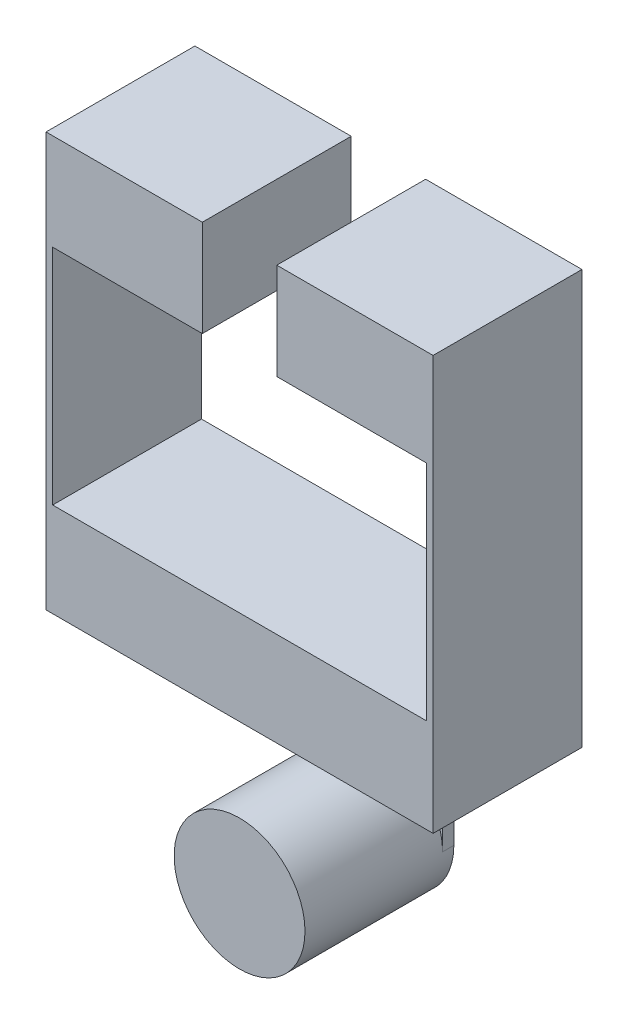
ISO-10303-21;
HEADER;
FILE_DESCRIPTION(('STEP AP214'),'2;1');
FILE_NAME('part.step','',(''),(''),'','','');
FILE_SCHEMA(('AUTOMOTIVE_DESIGN { 1 0 10303 214 1 1 1 1 }'));
ENDSEC;
DATA;
#1=APPLICATION_CONTEXT('core data for automotive mechanical design processes');
#2=APPLICATION_PROTOCOL_DEFINITION('international standard','automotive_design',2000,#1);
#3=PRODUCT_CONTEXT('',#1,'mechanical');
#4=PRODUCT('Part','Part','',(#3));
#5=PRODUCT_RELATED_PRODUCT_CATEGORY('part','',(#4));
#6=PRODUCT_DEFINITION_FORMATION('','',#4);
#7=PRODUCT_DEFINITION_CONTEXT('part definition',#1,'design');
#8=PRODUCT_DEFINITION('design','',#6,#7);
#9=PRODUCT_DEFINITION_SHAPE('','',#8);
#10=(LENGTH_UNIT() NAMED_UNIT(*) SI_UNIT(.MILLI.,.METRE.));
#11=(NAMED_UNIT(*) PLANE_ANGLE_UNIT() SI_UNIT($,.RADIAN.));
#12=(NAMED_UNIT(*) SI_UNIT($,.STERADIAN.) SOLID_ANGLE_UNIT());
#13=UNCERTAINTY_MEASURE_WITH_UNIT(LENGTH_MEASURE(1.E-05),#10,'distance_accuracy_value','');
#14=(GEOMETRIC_REPRESENTATION_CONTEXT(3) GLOBAL_UNCERTAINTY_ASSIGNED_CONTEXT((#13)) GLOBAL_UNIT_ASSIGNED_CONTEXT((#10,
#11,#12)) REPRESENTATION_CONTEXT('',''));
#15=CARTESIAN_POINT('',(0.,0.,0.));
#16=DIRECTION('',(0.,0.,1.));
#17=DIRECTION('',(1.,0.,0.));
#18=AXIS2_PLACEMENT_3D('',#15,#16,#17);
#19=CARTESIAN_POINT('',(0.,41.4643705136554,0.));
#20=DIRECTION('',(0.,-1.,0.));
#21=DIRECTION('',(0.,0.,-1.));
#22=AXIS2_PLACEMENT_3D('',#19,#20,#21);
#23=PLANE('',#22);
#24=DIRECTION('',(0.,0.,1.));
#25=VECTOR('',#24,1.);
#26=CARTESIAN_POINT('',(31.8903580164554,41.4643705136554,-25.4));
#27=LINE('',#26,#25);
#28=CARTESIAN_POINT('',(31.8903580164554,41.4643705136554,-25.4));
#29=VERTEX_POINT('',#28);
#30=CARTESIAN_POINT('',(31.8903580164554,41.4643705136554,0.));
#31=VERTEX_POINT('',#30);
#32=EDGE_CURVE('E69',#29,#31,#27,.T.);
#33=ORIENTED_EDGE('',*,*,#32,.F.);
#34=DIRECTION('',(-1.,0.,0.));
#35=VECTOR('',#34,1.);
#36=CARTESIAN_POINT('',(-33.02,41.4643705136554,-25.4));
#37=LINE('',#36,#35);
#38=CARTESIAN_POINT('',(-31.8903580164554,41.4643705136554,-25.4));
#39=VERTEX_POINT('',#38);
#40=EDGE_CURVE('E263',#29,#39,#37,.T.);
#41=ORIENTED_EDGE('',*,*,#40,.T.);
#42=DIRECTION('',(0.,0.,-1.));
#43=VECTOR('',#42,1.);
#44=CARTESIAN_POINT('',(-31.8903580164554,41.4643705136554,-25.4));
#45=LINE('',#44,#43);
#46=CARTESIAN_POINT('',(-31.8903580164554,41.4643705136554,0.));
#47=VERTEX_POINT('',#46);
#48=EDGE_CURVE('E243',#47,#39,#45,.T.);
#49=ORIENTED_EDGE('',*,*,#48,.F.);
#50=DIRECTION('',(1.,0.,0.));
#51=VECTOR('',#50,1.);
#52=CARTESIAN_POINT('',(-33.02,41.4643705136554,0.));
#53=LINE('',#52,#51);
#54=EDGE_CURVE('E74',#47,#31,#53,.T.);
#55=ORIENTED_EDGE('',*,*,#54,.T.);
#56=EDGE_LOOP('',(#33,#41,#49,#55));
#57=FACE_BOUND('',#56,.T.);
#58=ADVANCED_FACE('F52',(#57),#23,.F.);
#59=CARTESIAN_POINT('',(0.,0.,-25.4));
#60=DIRECTION('',(0.,0.,1.));
#61=DIRECTION('',(1.,0.,0.));
#62=AXIS2_PLACEMENT_3D('',#59,#60,#61);
#63=CYLINDRICAL_SURFACE('',#62,11.1628049548617);
#64=DIRECTION('',(0.,0.,-1.));
#65=VECTOR('',#64,1.);
#66=CARTESIAN_POINT('',(11.1628049548617,0.,-23.4735684489951));
#67=LINE('',#66,#65);
#68=CARTESIAN_POINT('',(11.1628049548617,0.,-23.4735684489951));
#69=VERTEX_POINT('',#68);
#70=CARTESIAN_POINT('',(11.1628049548617,0.,-25.4));
#71=VERTEX_POINT('',#70);
#72=EDGE_CURVE('E320',#69,#71,#67,.T.);
#73=ORIENTED_EDGE('',*,*,#72,.F.);
#74=CARTESIAN_POINT('',(0.,0.,-23.4735684489951));
#75=DIRECTION('',(0.,0.,1.));
#76=DIRECTION('',(-1.,0.,0.));
#77=AXIS2_PLACEMENT_3D('',#74,#75,#76);
#78=CIRCLE('',#77,11.1628049548617);
#79=CARTESIAN_POINT('',(-11.1628049548617,0.,-23.4735684489951));
#80=VERTEX_POINT('',#79);
#81=EDGE_CURVE('E296',#69,#80,#78,.T.);
#82=ORIENTED_EDGE('',*,*,#81,.T.);
#83=DIRECTION('',(0.,0.,-1.));
#84=VECTOR('',#83,1.);
#85=CARTESIAN_POINT('',(-11.1628049548617,0.,-23.4735684489951));
#86=LINE('',#85,#84);
#87=CARTESIAN_POINT('',(-11.1628049548617,0.,-25.4));
#88=VERTEX_POINT('',#87);
#89=EDGE_CURVE('E313',#80,#88,#86,.T.);
#90=ORIENTED_EDGE('',*,*,#89,.T.);
#91=CARTESIAN_POINT('',(0.,0.,-25.4));
#92=DIRECTION('',(0.,0.,1.));
#93=DIRECTION('',(1.,0.,0.));
#94=AXIS2_PLACEMENT_3D('',#91,#92,#93);
#95=CIRCLE('',#94,11.1628049548617);
#96=EDGE_CURVE('E12',#88,#71,#95,.T.);
#97=ORIENTED_EDGE('',*,*,#96,.T.);
#98=EDGE_LOOP('',(#73,#82,#90,#97));
#99=FACE_BOUND('',#98,.T.);
#100=CARTESIAN_POINT('',(0.,0.,0.));
#101=DIRECTION('',(0.,0.,1.));
#102=DIRECTION('',(1.,0.,0.));
#103=AXIS2_PLACEMENT_3D('',#100,#101,#102);
#104=CIRCLE('',#103,11.1628049548617);
#105=CARTESIAN_POINT('',(11.1628049548617,0.,0.));
#106=VERTEX_POINT('',#105);
#107=EDGE_CURVE('E56',#106,#106,#104,.T.);
#108=ORIENTED_EDGE('',*,*,#107,.F.);
#109=EDGE_LOOP('',(#108));
#110=FACE_BOUND('',#109,.T.);
#111=ADVANCED_FACE('F54',(#99,#110),#63,.T.);
#112=CARTESIAN_POINT('',(0.,0.,-25.4));
#113=DIRECTION('',(0.,0.,1.));
#114=DIRECTION('',(1.,0.,0.));
#115=AXIS2_PLACEMENT_3D('',#112,#113,#114);
#116=PLANE('',#115);
#117=ORIENTED_EDGE('',*,*,#96,.F.);
#118=DIRECTION('',(0.,1.,0.));
#119=VECTOR('',#118,1.);
#120=CARTESIAN_POINT('',(-11.1628049548617,25.4,-25.4));
#121=LINE('',#120,#119);
#122=CARTESIAN_POINT('',(-11.1628049548617,25.4,-25.4));
#123=VERTEX_POINT('',#122);
#124=EDGE_CURVE('E295',#88,#123,#121,.T.);
#125=ORIENTED_EDGE('',*,*,#124,.T.);
#126=DIRECTION('',(-1.,0.,0.));
#127=VECTOR('',#126,1.);
#128=CARTESIAN_POINT('',(-33.02,25.4,-25.4));
#129=LINE('',#128,#127);
#130=CARTESIAN_POINT('',(-33.02,25.4,-25.4));
#131=VERTEX_POINT('',#130);
#132=EDGE_CURVE('E277',#123,#131,#129,.T.);
#133=ORIENTED_EDGE('',*,*,#132,.T.);
#134=DIRECTION('',(0.,-1.,0.));
#135=VECTOR('',#134,1.);
#136=CARTESIAN_POINT('',(-33.02,41.4643705136554,-25.4));
#137=LINE('',#136,#135);
#138=CARTESIAN_POINT('',(-33.02,96.0254518876114,-25.4));
#139=VERTEX_POINT('',#138);
#140=EDGE_CURVE('E267',#139,#131,#137,.T.);
#141=ORIENTED_EDGE('',*,*,#140,.F.);
#142=DIRECTION('',(-1.,0.,0.));
#143=VECTOR('',#142,1.);
#144=CARTESIAN_POINT('',(-33.02,96.0254518876114,-25.4));
#145=LINE('',#144,#143);
#146=CARTESIAN_POINT('',(-6.34999999999999,96.0254518876114,-25.4));
#147=VERTEX_POINT('',#146);
#148=EDGE_CURVE('E184',#147,#139,#145,.T.);
#149=ORIENTED_EDGE('',*,*,#148,.F.);
#150=DIRECTION('',(0.,-1.,0.));
#151=VECTOR('',#150,1.);
#152=CARTESIAN_POINT('',(-6.34999999999999,96.0254518876114,-25.4));
#153=LINE('',#152,#151);
#154=CARTESIAN_POINT('',(-6.34999999999999,79.5643705136554,-25.4));
#155=VERTEX_POINT('',#154);
#156=EDGE_CURVE('E168',#147,#155,#153,.T.);
#157=ORIENTED_EDGE('',*,*,#156,.T.);
#158=DIRECTION('',(-1.,0.,0.));
#159=VECTOR('',#158,1.);
#160=CARTESIAN_POINT('',(-33.02,79.5643705136554,-25.4));
#161=LINE('',#160,#159);
#162=CARTESIAN_POINT('',(-31.8903580164554,79.5643705136554,-25.4));
#163=VERTEX_POINT('',#162);
#164=EDGE_CURVE('E177',#155,#163,#161,.T.);
#165=ORIENTED_EDGE('',*,*,#164,.T.);
#166=DIRECTION('',(0.,-1.,0.));
#167=VECTOR('',#166,1.);
#168=CARTESIAN_POINT('',(-31.8903580164554,79.5643705136554,-25.4));
#169=LINE('',#168,#167);
#170=EDGE_CURVE('E249',#163,#39,#169,.T.);
#171=ORIENTED_EDGE('',*,*,#170,.T.);
#172=ORIENTED_EDGE('',*,*,#40,.F.);
#173=DIRECTION('',(0.,-1.,0.));
#174=VECTOR('',#173,1.);
#175=CARTESIAN_POINT('',(31.8903580164554,79.5643705136554,-25.4));
#176=LINE('',#175,#174);
#177=CARTESIAN_POINT('',(31.8903580164554,79.5643705136554,-25.4));
#178=VERTEX_POINT('',#177);
#179=EDGE_CURVE('E232',#178,#29,#176,.T.);
#180=ORIENTED_EDGE('',*,*,#179,.F.);
#181=DIRECTION('',(-1.,0.,0.));
#182=VECTOR('',#181,1.);
#183=CARTESIAN_POINT('',(33.02,79.5643705136554,-25.4));
#184=LINE('',#183,#182);
#185=CARTESIAN_POINT('',(6.34999999999999,79.5643705136554,-25.4));
#186=VERTEX_POINT('',#185);
#187=EDGE_CURVE('E216',#178,#186,#184,.T.);
#188=ORIENTED_EDGE('',*,*,#187,.T.);
#189=DIRECTION('',(0.,-1.,0.));
#190=VECTOR('',#189,1.);
#191=CARTESIAN_POINT('',(6.34999999999999,96.0254518876114,-25.4));
#192=LINE('',#191,#190);
#193=CARTESIAN_POINT('',(6.34999999999999,96.0254518876114,-25.4));
#194=VERTEX_POINT('',#193);
#195=EDGE_CURVE('E227',#194,#186,#192,.T.);
#196=ORIENTED_EDGE('',*,*,#195,.F.);
#197=DIRECTION('',(-1.,0.,0.));
#198=VECTOR('',#197,1.);
#199=CARTESIAN_POINT('',(33.02,96.0254518876114,-25.4));
#200=LINE('',#199,#198);
#201=CARTESIAN_POINT('',(33.02,96.0254518876114,-25.4));
#202=VERTEX_POINT('',#201);
#203=EDGE_CURVE('E352',#202,#194,#200,.T.);
#204=ORIENTED_EDGE('',*,*,#203,.F.);
#205=DIRECTION('',(0.,-1.,0.));
#206=VECTOR('',#205,1.);
#207=CARTESIAN_POINT('',(33.02,41.4643705136554,-25.4));
#208=LINE('',#207,#206);
#209=CARTESIAN_POINT('',(33.02,25.4,-25.4));
#210=VERTEX_POINT('',#209);
#211=EDGE_CURVE('E284',#202,#210,#208,.T.);
#212=ORIENTED_EDGE('',*,*,#211,.T.);
#213=CARTESIAN_POINT('',(11.1628049548617,25.4,-25.4));
#214=VERTEX_POINT('',#213);
#215=EDGE_CURVE('E264',#210,#214,#129,.T.);
#216=ORIENTED_EDGE('',*,*,#215,.T.);
#217=DIRECTION('',(0.,-1.,0.));
#218=VECTOR('',#217,1.);
#219=CARTESIAN_POINT('',(11.1628049548617,0.,-25.4));
#220=LINE('',#219,#218);
#221=EDGE_CURVE('E301',#214,#71,#220,.T.);
#222=ORIENTED_EDGE('',*,*,#221,.T.);
#223=EDGE_LOOP('',(#117,#125,#133,#141,#149,#157,#165,#171,#172,#180,#188,#196,#204,#212,#216,#222));
#224=FACE_BOUND('',#223,.T.);
#225=ADVANCED_FACE('F181',(#224),#116,.F.);
#226=CARTESIAN_POINT('',(0.,0.,0.));
#227=DIRECTION('',(0.,0.,1.));
#228=DIRECTION('',(1.,0.,0.));
#229=AXIS2_PLACEMENT_3D('',#226,#227,#228);
#230=PLANE('',#229);
#231=ORIENTED_EDGE('',*,*,#107,.T.);
#232=EDGE_LOOP('',(#231));
#233=FACE_BOUND('',#232,.T.);
#234=ADVANCED_FACE('F480',(#233),#230,.T.);
#235=CARTESIAN_POINT('',(11.1628049548617,0.,-23.4735684489951));
#236=DIRECTION('',(1.,0.,0.));
#237=DIRECTION('',(0.,1.,0.));
#238=AXIS2_PLACEMENT_3D('',#235,#236,#237);
#239=PLANE('',#238);
#240=ORIENTED_EDGE('',*,*,#221,.F.);
#241=DIRECTION('',(0.,0.,-1.));
#242=VECTOR('',#241,1.);
#243=CARTESIAN_POINT('',(11.1628049548617,25.4,-23.4735684489951));
#244=LINE('',#243,#242);
#245=CARTESIAN_POINT('',(11.1628049548617,25.4,-23.4735684489951));
#246=VERTEX_POINT('',#245);
#247=EDGE_CURVE('E324',#246,#214,#244,.T.);
#248=ORIENTED_EDGE('',*,*,#247,.F.);
#249=DIRECTION('',(0.,-1.,0.));
#250=VECTOR('',#249,1.);
#251=CARTESIAN_POINT('',(11.1628049548617,0.,-23.4735684489951));
#252=LINE('',#251,#250);
#253=EDGE_CURVE('E309',#246,#69,#252,.T.);
#254=ORIENTED_EDGE('',*,*,#253,.T.);
#255=ORIENTED_EDGE('',*,*,#72,.T.);
#256=EDGE_LOOP('',(#240,#248,#254,#255));
#257=FACE_BOUND('',#256,.T.);
#258=ADVANCED_FACE('F388',(#257),#239,.T.);
#259=CARTESIAN_POINT('',(-11.1628049548617,25.4,-23.4735684489951));
#260=DIRECTION('',(-1.,0.,0.));
#261=DIRECTION('',(0.,0.,1.));
#262=AXIS2_PLACEMENT_3D('',#259,#260,#261);
#263=PLANE('',#262);
#264=ORIENTED_EDGE('',*,*,#124,.F.);
#265=ORIENTED_EDGE('',*,*,#89,.F.);
#266=DIRECTION('',(0.,1.,0.));
#267=VECTOR('',#266,1.);
#268=CARTESIAN_POINT('',(-11.1628049548617,25.4,-23.4735684489951));
#269=LINE('',#268,#267);
#270=CARTESIAN_POINT('',(-11.1628049548617,25.4,-23.4735684489951));
#271=VERTEX_POINT('',#270);
#272=EDGE_CURVE('E300',#80,#271,#269,.T.);
#273=ORIENTED_EDGE('',*,*,#272,.T.);
#274=DIRECTION('',(0.,0.,-1.));
#275=VECTOR('',#274,1.);
#276=CARTESIAN_POINT('',(-11.1628049548617,25.4,-23.4735684489951));
#277=LINE('',#276,#275);
#278=EDGE_CURVE('E328',#271,#123,#277,.T.);
#279=ORIENTED_EDGE('',*,*,#278,.T.);
#280=EDGE_LOOP('',(#264,#265,#273,#279));
#281=FACE_BOUND('',#280,.T.);
#282=ADVANCED_FACE('F340',(#281),#263,.T.);
#283=CARTESIAN_POINT('',(0.,0.,-23.4735684489951));
#284=DIRECTION('',(0.,0.,-1.));
#285=DIRECTION('',(-1.,0.,0.));
#286=AXIS2_PLACEMENT_3D('',#283,#284,#285);
#287=PLANE('',#286);
#288=ORIENTED_EDGE('',*,*,#81,.F.);
#289=ORIENTED_EDGE('',*,*,#253,.F.);
#290=DIRECTION('',(1.,0.,0.));
#291=VECTOR('',#290,1.);
#292=CARTESIAN_POINT('',(11.1628049548617,25.4,-23.4735684489951));
#293=LINE('',#292,#291);
#294=EDGE_CURVE('E305',#271,#246,#293,.T.);
#295=ORIENTED_EDGE('',*,*,#294,.F.);
#296=ORIENTED_EDGE('',*,*,#272,.F.);
#297=EDGE_LOOP('',(#288,#289,#295,#296));
#298=FACE_BOUND('',#297,.T.);
#299=ADVANCED_FACE('F390',(#298),#287,.F.);
#300=CARTESIAN_POINT('',(0.,25.4,0.));
#301=DIRECTION('',(0.,-1.,0.));
#302=DIRECTION('',(0.,0.,-1.));
#303=AXIS2_PLACEMENT_3D('',#300,#301,#302);
#304=PLANE('',#303);
#305=ORIENTED_EDGE('',*,*,#278,.F.);
#306=ORIENTED_EDGE('',*,*,#294,.T.);
#307=ORIENTED_EDGE('',*,*,#247,.T.);
#308=ORIENTED_EDGE('',*,*,#215,.F.);
#309=DIRECTION('',(0.,0.,-1.));
#310=VECTOR('',#309,1.);
#311=CARTESIAN_POINT('',(33.02,25.4,0.));
#312=LINE('',#311,#310);
#313=CARTESIAN_POINT('',(33.02,25.4,0.));
#314=VERTEX_POINT('',#313);
#315=EDGE_CURVE('E274',#314,#210,#312,.T.);
#316=ORIENTED_EDGE('',*,*,#315,.F.);
#317=DIRECTION('',(1.,0.,0.));
#318=VECTOR('',#317,1.);
#319=CARTESIAN_POINT('',(-33.02,25.4,0.));
#320=LINE('',#319,#318);
#321=CARTESIAN_POINT('',(-33.02,25.4,0.));
#322=VERTEX_POINT('',#321);
#323=EDGE_CURVE('E271',#322,#314,#320,.T.);
#324=ORIENTED_EDGE('',*,*,#323,.F.);
#325=DIRECTION('',(0.,0.,1.));
#326=VECTOR('',#325,1.);
#327=CARTESIAN_POINT('',(-33.02,25.4,0.));
#328=LINE('',#327,#326);
#329=EDGE_CURVE('E260',#131,#322,#328,.T.);
#330=ORIENTED_EDGE('',*,*,#329,.F.);
#331=ORIENTED_EDGE('',*,*,#132,.F.);
#332=EDGE_LOOP('',(#305,#306,#307,#308,#316,#324,#330,#331));
#333=FACE_BOUND('',#332,.T.);
#334=ADVANCED_FACE('F345',(#333),#304,.T.);
#335=CARTESIAN_POINT('',(-33.02,41.4643705136554,0.));
#336=DIRECTION('',(1.,0.,0.));
#337=DIRECTION('',(0.,0.,-1.));
#338=AXIS2_PLACEMENT_3D('',#335,#336,#337);
#339=PLANE('',#338);
#340=ORIENTED_EDGE('',*,*,#329,.T.);
#341=DIRECTION('',(0.,-1.,0.));
#342=VECTOR('',#341,1.);
#343=CARTESIAN_POINT('',(-33.02,41.4643705136554,0.));
#344=LINE('',#343,#342);
#345=CARTESIAN_POINT('',(-33.02,96.0254518876114,0.));
#346=VERTEX_POINT('',#345);
#347=EDGE_CURVE('E292',#346,#322,#344,.T.);
#348=ORIENTED_EDGE('',*,*,#347,.F.);
#349=DIRECTION('',(0.,0.,1.));
#350=VECTOR('',#349,1.);
#351=CARTESIAN_POINT('',(-33.02,96.0254518876114,0.));
#352=LINE('',#351,#350);
#353=EDGE_CURVE('E186',#139,#346,#352,.T.);
#354=ORIENTED_EDGE('',*,*,#353,.F.);
#355=ORIENTED_EDGE('',*,*,#140,.T.);
#356=EDGE_LOOP('',(#340,#348,#354,#355));
#357=FACE_BOUND('',#356,.T.);
#358=ADVANCED_FACE('F397',(#357),#339,.F.);
#359=CARTESIAN_POINT('',(-33.02,41.4643705136554,0.));
#360=DIRECTION('',(0.,0.,-1.));
#361=DIRECTION('',(-1.,0.,0.));
#362=AXIS2_PLACEMENT_3D('',#359,#360,#361);
#363=PLANE('',#362);
#364=ORIENTED_EDGE('',*,*,#323,.T.);
#365=DIRECTION('',(0.,-1.,0.));
#366=VECTOR('',#365,1.);
#367=CARTESIAN_POINT('',(33.02,41.4643705136554,0.));
#368=LINE('',#367,#366);
#369=CARTESIAN_POINT('',(33.02,96.0254518876114,0.));
#370=VERTEX_POINT('',#369);
#371=EDGE_CURVE('E288',#370,#314,#368,.T.);
#372=ORIENTED_EDGE('',*,*,#371,.F.);
#373=DIRECTION('',(1.,0.,0.));
#374=VECTOR('',#373,1.);
#375=CARTESIAN_POINT('',(33.02,96.0254518876114,0.));
#376=LINE('',#375,#374);
#377=CARTESIAN_POINT('',(6.34999999999999,96.0254518876114,0.));
#378=VERTEX_POINT('',#377);
#379=EDGE_CURVE('E228',#378,#370,#376,.T.);
#380=ORIENTED_EDGE('',*,*,#379,.F.);
#381=DIRECTION('',(0.,-1.,0.));
#382=VECTOR('',#381,1.);
#383=CARTESIAN_POINT('',(6.34999999999999,96.0254518876114,0.));
#384=LINE('',#383,#382);
#385=CARTESIAN_POINT('',(6.34999999999999,79.5643705136554,0.));
#386=VERTEX_POINT('',#385);
#387=EDGE_CURVE('E223',#378,#386,#384,.T.);
#388=ORIENTED_EDGE('',*,*,#387,.T.);
#389=DIRECTION('',(1.,0.,0.));
#390=VECTOR('',#389,1.);
#391=CARTESIAN_POINT('',(33.02,79.5643705136554,0.));
#392=LINE('',#391,#390);
#393=CARTESIAN_POINT('',(31.8903580164554,79.5643705136554,0.));
#394=VERTEX_POINT('',#393);
#395=EDGE_CURVE('E215',#386,#394,#392,.T.);
#396=ORIENTED_EDGE('',*,*,#395,.T.);
#397=DIRECTION('',(0.,-1.,0.));
#398=VECTOR('',#397,1.);
#399=CARTESIAN_POINT('',(31.8903580164554,79.5643705136554,0.));
#400=LINE('',#399,#398);
#401=EDGE_CURVE('E236',#394,#31,#400,.T.);
#402=ORIENTED_EDGE('',*,*,#401,.T.);
#403=ORIENTED_EDGE('',*,*,#54,.F.);
#404=DIRECTION('',(0.,-1.,0.));
#405=VECTOR('',#404,1.);
#406=CARTESIAN_POINT('',(-31.8903580164554,79.5643705136554,0.));
#407=LINE('',#406,#405);
#408=CARTESIAN_POINT('',(-31.8903580164554,79.5643705136554,0.));
#409=VERTEX_POINT('',#408);
#410=EDGE_CURVE('E255',#409,#47,#407,.T.);
#411=ORIENTED_EDGE('',*,*,#410,.F.);
#412=DIRECTION('',(1.,0.,0.));
#413=VECTOR('',#412,1.);
#414=CARTESIAN_POINT('',(-33.02,79.5643705136554,0.));
#415=LINE('',#414,#413);
#416=CARTESIAN_POINT('',(-6.34999999999999,79.5643705136554,0.));
#417=VERTEX_POINT('',#416);
#418=EDGE_CURVE('E176',#409,#417,#415,.T.);
#419=ORIENTED_EDGE('',*,*,#418,.T.);
#420=DIRECTION('',(0.,-1.,0.));
#421=VECTOR('',#420,1.);
#422=CARTESIAN_POINT('',(-6.34999999999999,96.0254518876114,0.));
#423=LINE('',#422,#421);
#424=CARTESIAN_POINT('',(-6.34999999999999,96.0254518876114,0.));
#425=VERTEX_POINT('',#424);
#426=EDGE_CURVE('E171',#425,#417,#423,.T.);
#427=ORIENTED_EDGE('',*,*,#426,.F.);
#428=DIRECTION('',(1.,0.,0.));
#429=VECTOR('',#428,1.);
#430=CARTESIAN_POINT('',(-33.02,96.0254518876114,0.));
#431=LINE('',#430,#429);
#432=EDGE_CURVE('E193',#346,#425,#431,.T.);
#433=ORIENTED_EDGE('',*,*,#432,.F.);
#434=ORIENTED_EDGE('',*,*,#347,.T.);
#435=EDGE_LOOP('',(#364,#372,#380,#388,#396,#402,#403,#411,#419,#427,#433,#434));
#436=FACE_BOUND('',#435,.T.);
#437=ADVANCED_FACE('F361',(#436),#363,.F.);
#438=CARTESIAN_POINT('',(33.02,41.4643705136554,0.));
#439=DIRECTION('',(-1.,0.,0.));
#440=DIRECTION('',(0.,0.,1.));
#441=AXIS2_PLACEMENT_3D('',#438,#439,#440);
#442=PLANE('',#441);
#443=ORIENTED_EDGE('',*,*,#315,.T.);
#444=ORIENTED_EDGE('',*,*,#211,.F.);
#445=DIRECTION('',(0.,0.,-1.));
#446=VECTOR('',#445,1.);
#447=CARTESIAN_POINT('',(33.02,96.0254518876114,0.));
#448=LINE('',#447,#446);
#449=EDGE_CURVE('E222',#370,#202,#448,.T.);
#450=ORIENTED_EDGE('',*,*,#449,.F.);
#451=ORIENTED_EDGE('',*,*,#371,.T.);
#452=EDGE_LOOP('',(#443,#444,#450,#451));
#453=FACE_BOUND('',#452,.T.);
#454=ADVANCED_FACE('F411',(#453),#442,.F.);
#455=CARTESIAN_POINT('',(-31.8903580164554,79.5643705136554,-25.4));
#456=DIRECTION('',(-1.,0.,0.));
#457=DIRECTION('',(0.,0.,1.));
#458=AXIS2_PLACEMENT_3D('',#455,#456,#457);
#459=PLANE('',#458);
#460=ORIENTED_EDGE('',*,*,#48,.T.);
#461=ORIENTED_EDGE('',*,*,#170,.F.);
#462=DIRECTION('',(0.,0.,-1.));
#463=VECTOR('',#462,1.);
#464=CARTESIAN_POINT('',(-31.8903580164554,79.5643705136554,-25.4));
#465=LINE('',#464,#463);
#466=EDGE_CURVE('E191',#409,#163,#465,.T.);
#467=ORIENTED_EDGE('',*,*,#466,.F.);
#468=ORIENTED_EDGE('',*,*,#410,.T.);
#469=EDGE_LOOP('',(#460,#461,#467,#468));
#470=FACE_BOUND('',#469,.T.);
#471=ADVANCED_FACE('F364',(#470),#459,.F.);
#472=CARTESIAN_POINT('',(31.8903580164554,79.5643705136554,-25.4));
#473=DIRECTION('',(1.,0.,0.));
#474=DIRECTION('',(0.,0.,-1.));
#475=AXIS2_PLACEMENT_3D('',#472,#473,#474);
#476=PLANE('',#475);
#477=ORIENTED_EDGE('',*,*,#32,.T.);
#478=ORIENTED_EDGE('',*,*,#401,.F.);
#479=DIRECTION('',(0.,0.,1.));
#480=VECTOR('',#479,1.);
#481=CARTESIAN_POINT('',(31.8903580164554,79.5643705136554,-25.4));
#482=LINE('',#481,#480);
#483=EDGE_CURVE('E240',#178,#394,#482,.T.);
#484=ORIENTED_EDGE('',*,*,#483,.F.);
#485=ORIENTED_EDGE('',*,*,#179,.T.);
#486=EDGE_LOOP('',(#477,#478,#484,#485));
#487=FACE_BOUND('',#486,.T.);
#488=ADVANCED_FACE('F367',(#487),#476,.F.);
#489=CARTESIAN_POINT('',(0.,79.5643705136554,0.));
#490=DIRECTION('',(0.,1.,0.));
#491=DIRECTION('',(0.,0.,1.));
#492=AXIS2_PLACEMENT_3D('',#489,#490,#491);
#493=PLANE('',#492);
#494=ORIENTED_EDGE('',*,*,#187,.F.);
#495=ORIENTED_EDGE('',*,*,#483,.T.);
#496=ORIENTED_EDGE('',*,*,#395,.F.);
#497=DIRECTION('',(0.,0.,1.));
#498=VECTOR('',#497,1.);
#499=CARTESIAN_POINT('',(6.34999999999999,79.5643705136554,0.));
#500=LINE('',#499,#498);
#501=EDGE_CURVE('E211',#186,#386,#500,.T.);
#502=ORIENTED_EDGE('',*,*,#501,.F.);
#503=EDGE_LOOP('',(#494,#495,#496,#502));
#504=FACE_BOUND('',#503,.T.);
#505=ADVANCED_FACE('F372',(#504),#493,.F.);
#506=CARTESIAN_POINT('',(6.34999999999999,96.0254518876114,0.));
#507=DIRECTION('',(1.,0.,0.));
#508=DIRECTION('',(0.,0.,-1.));
#509=AXIS2_PLACEMENT_3D('',#506,#507,#508);
#510=PLANE('',#509);
#511=ORIENTED_EDGE('',*,*,#501,.T.);
#512=ORIENTED_EDGE('',*,*,#387,.F.);
#513=DIRECTION('',(0.,0.,1.));
#514=VECTOR('',#513,1.);
#515=CARTESIAN_POINT('',(6.34999999999999,96.0254518876114,0.));
#516=LINE('',#515,#514);
#517=EDGE_CURVE('E350',#194,#378,#516,.T.);
#518=ORIENTED_EDGE('',*,*,#517,.F.);
#519=ORIENTED_EDGE('',*,*,#195,.T.);
#520=EDGE_LOOP('',(#511,#512,#518,#519));
#521=FACE_BOUND('',#520,.T.);
#522=ADVANCED_FACE('F377',(#521),#510,.F.);
#523=CARTESIAN_POINT('',(0.,96.0254518876114,0.));
#524=DIRECTION('',(0.,1.,0.));
#525=DIRECTION('',(0.,0.,1.));
#526=AXIS2_PLACEMENT_3D('',#523,#524,#525);
#527=PLANE('',#526);
#528=ORIENTED_EDGE('',*,*,#449,.T.);
#529=ORIENTED_EDGE('',*,*,#203,.T.);
#530=ORIENTED_EDGE('',*,*,#517,.T.);
#531=ORIENTED_EDGE('',*,*,#379,.T.);
#532=EDGE_LOOP('',(#528,#529,#530,#531));
#533=FACE_BOUND('',#532,.T.);
#534=ADVANCED_FACE('F381',(#533),#527,.T.);
#535=CARTESIAN_POINT('',(0.,79.5643705136554,0.));
#536=DIRECTION('',(0.,1.,0.));
#537=DIRECTION('',(0.,0.,1.));
#538=AXIS2_PLACEMENT_3D('',#535,#536,#537);
#539=PLANE('',#538);
#540=ORIENTED_EDGE('',*,*,#418,.F.);
#541=ORIENTED_EDGE('',*,*,#466,.T.);
#542=ORIENTED_EDGE('',*,*,#164,.F.);
#543=DIRECTION('',(0.,0.,-1.));
#544=VECTOR('',#543,1.);
#545=CARTESIAN_POINT('',(-6.34999999999999,79.5643705136554,0.));
#546=LINE('',#545,#544);
#547=EDGE_CURVE('E165',#417,#155,#546,.T.);
#548=ORIENTED_EDGE('',*,*,#547,.F.);
#549=EDGE_LOOP('',(#540,#541,#542,#548));
#550=FACE_BOUND('',#549,.T.);
#551=ADVANCED_FACE('F189',(#550),#539,.F.);
#552=CARTESIAN_POINT('',(-6.34999999999999,96.0254518876114,0.));
#553=DIRECTION('',(-1.,0.,0.));
#554=DIRECTION('',(0.,0.,1.));
#555=AXIS2_PLACEMENT_3D('',#552,#553,#554);
#556=PLANE('',#555);
#557=ORIENTED_EDGE('',*,*,#547,.T.);
#558=ORIENTED_EDGE('',*,*,#156,.F.);
#559=DIRECTION('',(0.,0.,-1.));
#560=VECTOR('',#559,1.);
#561=CARTESIAN_POINT('',(-6.34999999999999,96.0254518876114,0.));
#562=LINE('',#561,#560);
#563=EDGE_CURVE('E197',#425,#147,#562,.T.);
#564=ORIENTED_EDGE('',*,*,#563,.F.);
#565=ORIENTED_EDGE('',*,*,#426,.T.);
#566=EDGE_LOOP('',(#557,#558,#564,#565));
#567=FACE_BOUND('',#566,.T.);
#568=ADVANCED_FACE('F167',(#567),#556,.F.);
#569=CARTESIAN_POINT('',(0.,96.0254518876114,0.));
#570=DIRECTION('',(0.,1.,0.));
#571=DIRECTION('',(0.,0.,1.));
#572=AXIS2_PLACEMENT_3D('',#569,#570,#571);
#573=PLANE('',#572);
#574=ORIENTED_EDGE('',*,*,#432,.T.);
#575=ORIENTED_EDGE('',*,*,#563,.T.);
#576=ORIENTED_EDGE('',*,*,#148,.T.);
#577=ORIENTED_EDGE('',*,*,#353,.T.);
#578=EDGE_LOOP('',(#574,#575,#576,#577));
#579=FACE_BOUND('',#578,.T.);
#580=ADVANCED_FACE('F422',(#579),#573,.T.);
#581=CLOSED_SHELL('',(#58,#111,#225,#234,#258,#282,#299,#334,#358,#437,#454,#471,#488,#505,#522,
#534,#551,#568,#580));
#582=MANIFOLD_SOLID_BREP('B2',#581);
#583=ADVANCED_BREP_SHAPE_REPRESENTATION('',(#18,#582),#14);
#584=SHAPE_DEFINITION_REPRESENTATION(#9,#583);
ENDSEC;
END-ISO-10303-21;
